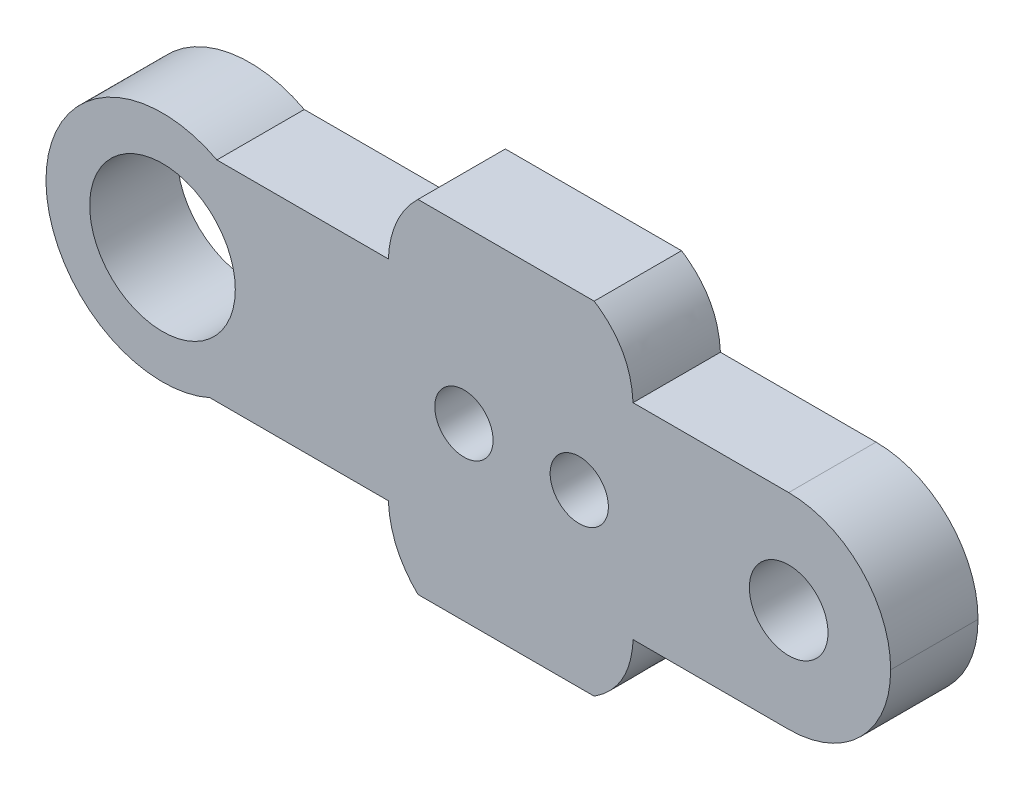
ISO-10303-21;
HEADER;
FILE_DESCRIPTION(('STEP AP214'),'2;1');
FILE_NAME('part.step','',(''),(''),'','','');
FILE_SCHEMA(('AUTOMOTIVE_DESIGN { 1 0 10303 214 1 1 1 1 }'));
ENDSEC;
DATA;
#1=APPLICATION_CONTEXT('core data for automotive mechanical design processes');
#2=APPLICATION_PROTOCOL_DEFINITION('international standard','automotive_design',2000,#1);
#3=PRODUCT_CONTEXT('',#1,'mechanical');
#4=PRODUCT('Part','Part','',(#3));
#5=PRODUCT_RELATED_PRODUCT_CATEGORY('part','',(#4));
#6=PRODUCT_DEFINITION_FORMATION('','',#4);
#7=PRODUCT_DEFINITION_CONTEXT('part definition',#1,'design');
#8=PRODUCT_DEFINITION('design','',#6,#7);
#9=PRODUCT_DEFINITION_SHAPE('','',#8);
#10=(LENGTH_UNIT() NAMED_UNIT(*) SI_UNIT(.MILLI.,.METRE.));
#11=(NAMED_UNIT(*) PLANE_ANGLE_UNIT() SI_UNIT($,.RADIAN.));
#12=(NAMED_UNIT(*) SI_UNIT($,.STERADIAN.) SOLID_ANGLE_UNIT());
#13=UNCERTAINTY_MEASURE_WITH_UNIT(LENGTH_MEASURE(1.E-05),#10,'distance_accuracy_value','');
#14=(GEOMETRIC_REPRESENTATION_CONTEXT(3) GLOBAL_UNCERTAINTY_ASSIGNED_CONTEXT((#13)) GLOBAL_UNIT_ASSIGNED_CONTEXT((#10,
#11,#12)) REPRESENTATION_CONTEXT('',''));
#15=CARTESIAN_POINT('',(0.,0.,0.));
#16=DIRECTION('',(0.,0.,1.));
#17=DIRECTION('',(1.,0.,0.));
#18=AXIS2_PLACEMENT_3D('',#15,#16,#17);
#19=CARTESIAN_POINT('',(21.4999681225819,-0.0214101903655824,3.));
#20=DIRECTION('',(0.,0.,-1.));
#21=DIRECTION('',(-1.,0.,0.));
#22=AXIS2_PLACEMENT_3D('',#19,#20,#21);
#23=PLANE('',#22);
#24=CARTESIAN_POINT('',(21.4999681225819,-0.0214101903655824,3.));
#25=DIRECTION('',(0.,0.,1.));
#26=DIRECTION('',(-1.,0.,0.));
#27=AXIS2_PLACEMENT_3D('',#24,#25,#26);
#28=CIRCLE('',#27,3.50000000000029);
#29=CARTESIAN_POINT('',(21.4999681225822,-3.52141019036587,3.));
#30=VERTEX_POINT('',#29);
#31=CARTESIAN_POINT('',(24.9999026367908,-1.06424607624819E-12,3.));
#32=VERTEX_POINT('',#31);
#33=EDGE_CURVE('E249',#30,#32,#28,.T.);
#34=ORIENTED_EDGE('',*,*,#33,.T.);
#35=CARTESIAN_POINT('',(21.4999681225822,0.0214101903658728,3.));
#36=DIRECTION('',(0.,0.,1.));
#37=DIRECTION('',(1.,0.,0.));
#38=AXIS2_PLACEMENT_3D('',#35,#36,#37);
#39=CIRCLE('',#38,3.5);
#40=CARTESIAN_POINT('',(21.4999681225822,3.52141019036587,3.));
#41=VERTEX_POINT('',#40);
#42=EDGE_CURVE('E115',#32,#41,#39,.T.);
#43=ORIENTED_EDGE('',*,*,#42,.T.);
#44=DIRECTION('',(-1.,0.,0.));
#45=VECTOR('',#44,1.);
#46=CARTESIAN_POINT('',(21.4999681225822,3.52141019036587,3.));
#47=LINE('',#46,#45);
#48=CARTESIAN_POINT('',(16.1562785524943,3.52141019036587,3.));
#49=VERTEX_POINT('',#48);
#50=EDGE_CURVE('E241',#41,#49,#47,.T.);
#51=ORIENTED_EDGE('',*,*,#50,.T.);
#52=CARTESIAN_POINT('',(16.1562785524943,3.52141019036587,3.));
#53=CARTESIAN_POINT('',(16.0881603388808,5.05153717266608,3.));
#54=CARTESIAN_POINT('',(14.8219003344393,5.87390950454192,3.));
#55=B_SPLINE_CURVE_WITH_KNOTS('',2,(#52,#53,#54),.UNSPECIFIED.,.F.,.F.,(3,3),(0.,1.),.UNSPECIFIED.);
#56=CARTESIAN_POINT('',(14.8219003344393,5.87390950454192,3.));
#57=VERTEX_POINT('',#56);
#58=EDGE_CURVE('E235',#49,#57,#55,.T.);
#59=ORIENTED_EDGE('',*,*,#58,.T.);
#60=DIRECTION('',(-1.,0.,0.));
#61=VECTOR('',#60,1.);
#62=CARTESIAN_POINT('',(8.77128221695817,5.87390950454192,3.));
#63=LINE('',#62,#61);
#64=CARTESIAN_POINT('',(8.77128221695817,5.87390950454192,3.));
#65=VERTEX_POINT('',#64);
#66=EDGE_CURVE('E214',#57,#65,#63,.T.);
#67=ORIENTED_EDGE('',*,*,#66,.T.);
#68=CARTESIAN_POINT('',(8.77128221695817,5.87390950454192,3.));
#69=CARTESIAN_POINT('',(7.81640396631,4.94468910288925,3.));
#70=CARTESIAN_POINT('',(7.75477837322135,3.59527965532397,3.));
#71=B_SPLINE_CURVE_WITH_KNOTS('',2,(#68,#69,#70),.UNSPECIFIED.,.F.,.F.,(3,3),(0.,1.),.UNSPECIFIED.);
#72=CARTESIAN_POINT('',(7.75477837322135,3.59527965532397,3.));
#73=VERTEX_POINT('',#72);
#74=EDGE_CURVE('E208',#65,#73,#71,.T.);
#75=ORIENTED_EDGE('',*,*,#74,.T.);
#76=DIRECTION('',(-1.,0.,0.));
#77=VECTOR('',#76,1.);
#78=CARTESIAN_POINT('',(1.86834673217975,3.59527965532397,3.));
#79=LINE('',#78,#77);
#80=CARTESIAN_POINT('',(1.86834673217975,3.59527965532397,3.));
#81=VERTEX_POINT('',#80);
#82=EDGE_CURVE('E205',#73,#81,#79,.T.);
#83=ORIENTED_EDGE('',*,*,#82,.T.);
#84=CARTESIAN_POINT('',(0.,0.0584335336566329,3.));
#85=DIRECTION('',(0.,0.,1.));
#86=DIRECTION('',(1.,0.,0.));
#87=AXIS2_PLACEMENT_3D('',#84,#85,#86);
#88=CIRCLE('',#87,4.);
#89=CARTESIAN_POINT('',(1.62799875081931,-3.59527965532397,3.));
#90=VERTEX_POINT('',#89);
#91=EDGE_CURVE('E202',#81,#90,#88,.T.);
#92=ORIENTED_EDGE('',*,*,#91,.T.);
#93=DIRECTION('',(1.,0.,0.));
#94=VECTOR('',#93,1.);
#95=CARTESIAN_POINT('',(1.62799875081931,-3.59527965532397,3.));
#96=LINE('',#95,#94);
#97=CARTESIAN_POINT('',(7.75477837322134,-3.59527965532397,3.));
#98=VERTEX_POINT('',#97);
#99=EDGE_CURVE('E196',#90,#98,#96,.T.);
#100=ORIENTED_EDGE('',*,*,#99,.T.);
#101=CARTESIAN_POINT('',(7.75477837322134,-3.59527965532397,3.));
#102=CARTESIAN_POINT('',(7.81640396631,-4.94468910288925,3.));
#103=CARTESIAN_POINT('',(8.77128221695817,-5.87390950454192,3.));
#104=B_SPLINE_CURVE_WITH_KNOTS('',2,(#101,#102,#103),.UNSPECIFIED.,.F.,.F.,(3,3),(0.,1.),.UNSPECIFIED.);
#105=CARTESIAN_POINT('',(8.77128221695817,-5.87390950454192,3.));
#106=VERTEX_POINT('',#105);
#107=EDGE_CURVE('E149',#98,#106,#104,.T.);
#108=ORIENTED_EDGE('',*,*,#107,.T.);
#109=DIRECTION('',(1.,0.,0.));
#110=VECTOR('',#109,1.);
#111=CARTESIAN_POINT('',(8.77128221695817,-5.87390950454192,3.));
#112=LINE('',#111,#110);
#113=CARTESIAN_POINT('',(14.8219003344393,-5.87390950454192,3.));
#114=VERTEX_POINT('',#113);
#115=EDGE_CURVE('E143',#106,#114,#112,.T.);
#116=ORIENTED_EDGE('',*,*,#115,.T.);
#117=CARTESIAN_POINT('',(14.8219003344393,-5.87390950454192,3.));
#118=CARTESIAN_POINT('',(16.0881603388808,-5.05153717266608,3.));
#119=CARTESIAN_POINT('',(16.1562785524943,-3.52141019036587,3.));
#120=B_SPLINE_CURVE_WITH_KNOTS('',2,(#117,#118,#119),.UNSPECIFIED.,.F.,.F.,(3,3),(0.,1.),.UNSPECIFIED.);
#121=CARTESIAN_POINT('',(16.1562785524943,-3.52141019036587,3.));
#122=VERTEX_POINT('',#121);
#123=EDGE_CURVE('E147',#114,#122,#120,.T.);
#124=ORIENTED_EDGE('',*,*,#123,.T.);
#125=DIRECTION('',(1.,0.,0.));
#126=VECTOR('',#125,1.);
#127=CARTESIAN_POINT('',(21.4999681225822,-3.52141019036587,3.));
#128=LINE('',#127,#126);
#129=EDGE_CURVE('E57',#122,#30,#128,.T.);
#130=ORIENTED_EDGE('',*,*,#129,.T.);
#131=EDGE_LOOP('',(#34,#43,#51,#59,#67,#75,#83,#92,#100,#108,#116,#124,#130));
#132=FACE_BOUND('',#131,.T.);
#133=CARTESIAN_POINT('',(0.,0.0584335336566329,3.));
#134=DIRECTION('',(0.,0.,1.));
#135=DIRECTION('',(1.,0.,0.));
#136=AXIS2_PLACEMENT_3D('',#133,#134,#135);
#137=CIRCLE('',#136,2.5);
#138=CARTESIAN_POINT('',(2.5,0.0584335336566329,3.));
#139=VERTEX_POINT('',#138);
#140=EDGE_CURVE('E256',#139,#139,#137,.T.);
#141=ORIENTED_EDGE('',*,*,#140,.F.);
#142=EDGE_LOOP('',(#141));
#143=FACE_BOUND('',#142,.T.);
#144=CARTESIAN_POINT('',(10.35,0.,3.));
#145=DIRECTION('',(0.,0.,1.));
#146=DIRECTION('',(1.,0.,0.));
#147=AXIS2_PLACEMENT_3D('',#144,#145,#146);
#148=CIRCLE('',#147,1.);
#149=CARTESIAN_POINT('',(11.35,0.,3.));
#150=VERTEX_POINT('',#149);
#151=EDGE_CURVE('E257',#150,#150,#148,.T.);
#152=ORIENTED_EDGE('',*,*,#151,.F.);
#153=EDGE_LOOP('',(#152));
#154=FACE_BOUND('',#153,.T.);
#155=CARTESIAN_POINT('',(14.31,0.,3.));
#156=DIRECTION('',(0.,0.,1.));
#157=DIRECTION('',(1.,0.,0.));
#158=AXIS2_PLACEMENT_3D('',#155,#156,#157);
#159=CIRCLE('',#158,1.);
#160=CARTESIAN_POINT('',(15.31,0.,3.));
#161=VERTEX_POINT('',#160);
#162=EDGE_CURVE('E266',#161,#161,#159,.T.);
#163=ORIENTED_EDGE('',*,*,#162,.F.);
#164=EDGE_LOOP('',(#163));
#165=FACE_BOUND('',#164,.T.);
#166=CARTESIAN_POINT('',(21.4999681225822,0.0214101903658728,3.));
#167=DIRECTION('',(0.,0.,1.));
#168=DIRECTION('',(1.,0.,0.));
#169=AXIS2_PLACEMENT_3D('',#166,#167,#168);
#170=CIRCLE('',#169,1.35);
#171=CARTESIAN_POINT('',(22.8499681225822,0.0214101903658728,3.));
#172=VERTEX_POINT('',#171);
#173=EDGE_CURVE('E274',#172,#172,#170,.T.);
#174=ORIENTED_EDGE('',*,*,#173,.F.);
#175=EDGE_LOOP('',(#174));
#176=FACE_BOUND('',#175,.T.);
#177=ADVANCED_FACE('F39',(#132,#143,#154,#165,#176),#23,.F.);
#178=CARTESIAN_POINT('',(21.4999681225819,-0.0214101903655824,0.));
#179=DIRECTION('',(0.,0.,-1.));
#180=DIRECTION('',(-1.,0.,0.));
#181=AXIS2_PLACEMENT_3D('',#178,#179,#180);
#182=PLANE('',#181);
#183=CARTESIAN_POINT('',(14.31,0.,0.));
#184=DIRECTION('',(0.,0.,1.));
#185=DIRECTION('',(1.,0.,0.));
#186=AXIS2_PLACEMENT_3D('',#183,#184,#185);
#187=CIRCLE('',#186,1.);
#188=CARTESIAN_POINT('',(15.31,0.,0.));
#189=VERTEX_POINT('',#188);
#190=EDGE_CURVE('E270',#189,#189,#187,.T.);
#191=ORIENTED_EDGE('',*,*,#190,.T.);
#192=EDGE_LOOP('',(#191));
#193=FACE_BOUND('',#192,.T.);
#194=CARTESIAN_POINT('',(0.,0.0584335336566329,0.));
#195=DIRECTION('',(0.,0.,1.));
#196=DIRECTION('',(1.,0.,0.));
#197=AXIS2_PLACEMENT_3D('',#194,#195,#196);
#198=CIRCLE('',#197,2.5);
#199=CARTESIAN_POINT('',(2.5,0.0584335336566329,0.));
#200=VERTEX_POINT('',#199);
#201=EDGE_CURVE('E252',#200,#200,#198,.T.);
#202=ORIENTED_EDGE('',*,*,#201,.T.);
#203=EDGE_LOOP('',(#202));
#204=FACE_BOUND('',#203,.T.);
#205=CARTESIAN_POINT('',(21.4999681225819,-0.0214101903655824,0.));
#206=DIRECTION('',(0.,0.,1.));
#207=DIRECTION('',(-1.,0.,0.));
#208=AXIS2_PLACEMENT_3D('',#205,#206,#207);
#209=CIRCLE('',#208,3.50000000000029);
#210=CARTESIAN_POINT('',(21.4999681225822,-3.52141019036587,0.));
#211=VERTEX_POINT('',#210);
#212=CARTESIAN_POINT('',(24.9999026367908,-1.06424607624819E-12,0.));
#213=VERTEX_POINT('',#212);
#214=EDGE_CURVE('E261',#211,#213,#209,.T.);
#215=ORIENTED_EDGE('',*,*,#214,.F.);
#216=DIRECTION('',(1.,0.,0.));
#217=VECTOR('',#216,1.);
#218=CARTESIAN_POINT('',(21.4999681225822,-3.52141019036587,0.));
#219=LINE('',#218,#217);
#220=CARTESIAN_POINT('',(16.1562785524943,-3.52141019036587,0.));
#221=VERTEX_POINT('',#220);
#222=EDGE_CURVE('E107',#221,#211,#219,.T.);
#223=ORIENTED_EDGE('',*,*,#222,.F.);
#224=CARTESIAN_POINT('',(14.8219003344393,-5.87390950454192,0.));
#225=CARTESIAN_POINT('',(16.0881603388808,-5.05153717266608,0.));
#226=CARTESIAN_POINT('',(16.1562785524943,-3.52141019036587,0.));
#227=B_SPLINE_CURVE_WITH_KNOTS('',2,(#224,#225,#226),.UNSPECIFIED.,.F.,.F.,(3,3),(0.,1.),.UNSPECIFIED.);
#228=CARTESIAN_POINT('',(14.8219003344393,-5.87390950454192,0.));
#229=VERTEX_POINT('',#228);
#230=EDGE_CURVE('E101',#229,#221,#227,.T.);
#231=ORIENTED_EDGE('',*,*,#230,.F.);
#232=DIRECTION('',(1.,0.,0.));
#233=VECTOR('',#232,1.);
#234=CARTESIAN_POINT('',(8.77128221695817,-5.87390950454192,0.));
#235=LINE('',#234,#233);
#236=CARTESIAN_POINT('',(8.77128221695817,-5.87390950454192,0.));
#237=VERTEX_POINT('',#236);
#238=EDGE_CURVE('E158',#237,#229,#235,.T.);
#239=ORIENTED_EDGE('',*,*,#238,.F.);
#240=CARTESIAN_POINT('',(7.75477837322134,-3.59527965532397,0.));
#241=CARTESIAN_POINT('',(7.81640396631,-4.94468910288925,0.));
#242=CARTESIAN_POINT('',(8.77128221695817,-5.87390950454192,0.));
#243=B_SPLINE_CURVE_WITH_KNOTS('',2,(#240,#241,#242),.UNSPECIFIED.,.F.,.F.,(3,3),(0.,1.),.UNSPECIFIED.);
#244=CARTESIAN_POINT('',(7.75477837322134,-3.59527965532397,0.));
#245=VERTEX_POINT('',#244);
#246=EDGE_CURVE('E477',#245,#237,#243,.T.);
#247=ORIENTED_EDGE('',*,*,#246,.F.);
#248=DIRECTION('',(1.,0.,0.));
#249=VECTOR('',#248,1.);
#250=CARTESIAN_POINT('',(1.62799875081931,-3.59527965532397,0.));
#251=LINE('',#250,#249);
#252=CARTESIAN_POINT('',(1.62799875081931,-3.59527965532397,0.));
#253=VERTEX_POINT('',#252);
#254=EDGE_CURVE('E474',#253,#245,#251,.T.);
#255=ORIENTED_EDGE('',*,*,#254,.F.);
#256=CARTESIAN_POINT('',(0.,0.0584335336566329,0.));
#257=DIRECTION('',(0.,0.,1.));
#258=DIRECTION('',(1.,0.,0.));
#259=AXIS2_PLACEMENT_3D('',#256,#257,#258);
#260=CIRCLE('',#259,4.);
#261=CARTESIAN_POINT('',(1.86834673217975,3.59527965532397,0.));
#262=VERTEX_POINT('',#261);
#263=EDGE_CURVE('E471',#262,#253,#260,.T.);
#264=ORIENTED_EDGE('',*,*,#263,.F.);
#265=DIRECTION('',(-1.,0.,0.));
#266=VECTOR('',#265,1.);
#267=CARTESIAN_POINT('',(1.86834673217975,3.59527965532397,0.));
#268=LINE('',#267,#266);
#269=CARTESIAN_POINT('',(7.75477837322135,3.59527965532397,0.));
#270=VERTEX_POINT('',#269);
#271=EDGE_CURVE('E465',#270,#262,#268,.T.);
#272=ORIENTED_EDGE('',*,*,#271,.F.);
#273=CARTESIAN_POINT('',(8.77128221695817,5.87390950454192,0.));
#274=CARTESIAN_POINT('',(7.81640396631,4.94468910288925,0.));
#275=CARTESIAN_POINT('',(7.75477837322135,3.59527965532397,0.));
#276=B_SPLINE_CURVE_WITH_KNOTS('',2,(#273,#274,#275),.UNSPECIFIED.,.F.,.F.,(3,3),(0.,1.),.UNSPECIFIED.);
#277=CARTESIAN_POINT('',(8.77128221695817,5.87390950454192,0.));
#278=VERTEX_POINT('',#277);
#279=EDGE_CURVE('E460',#278,#270,#276,.T.);
#280=ORIENTED_EDGE('',*,*,#279,.F.);
#281=DIRECTION('',(-1.,0.,0.));
#282=VECTOR('',#281,1.);
#283=CARTESIAN_POINT('',(8.77128221695817,5.87390950454192,0.));
#284=LINE('',#283,#282);
#285=CARTESIAN_POINT('',(14.8219003344393,5.87390950454192,0.));
#286=VERTEX_POINT('',#285);
#287=EDGE_CURVE('E454',#286,#278,#284,.T.);
#288=ORIENTED_EDGE('',*,*,#287,.F.);
#289=CARTESIAN_POINT('',(16.1562785524943,3.52141019036587,0.));
#290=CARTESIAN_POINT('',(16.0881603388808,5.05153717266608,0.));
#291=CARTESIAN_POINT('',(14.8219003344393,5.87390950454192,0.));
#292=B_SPLINE_CURVE_WITH_KNOTS('',2,(#289,#290,#291),.UNSPECIFIED.,.F.,.F.,(3,3),(0.,1.),.UNSPECIFIED.);
#293=CARTESIAN_POINT('',(16.1562785524943,3.52141019036587,0.));
#294=VERTEX_POINT('',#293);
#295=EDGE_CURVE('E449',#294,#286,#292,.T.);
#296=ORIENTED_EDGE('',*,*,#295,.F.);
#297=DIRECTION('',(-1.,0.,0.));
#298=VECTOR('',#297,1.);
#299=CARTESIAN_POINT('',(21.4999681225822,3.52141019036587,0.));
#300=LINE('',#299,#298);
#301=CARTESIAN_POINT('',(21.4999681225822,3.52141019036587,0.));
#302=VERTEX_POINT('',#301);
#303=EDGE_CURVE('E444',#302,#294,#300,.T.);
#304=ORIENTED_EDGE('',*,*,#303,.F.);
#305=CARTESIAN_POINT('',(21.4999681225822,0.0214101903658728,0.));
#306=DIRECTION('',(0.,0.,1.));
#307=DIRECTION('',(1.,0.,0.));
#308=AXIS2_PLACEMENT_3D('',#305,#306,#307);
#309=CIRCLE('',#308,3.5);
#310=EDGE_CURVE('E442',#213,#302,#309,.T.);
#311=ORIENTED_EDGE('',*,*,#310,.F.);
#312=EDGE_LOOP('',(#215,#223,#231,#239,#247,#255,#264,#272,#280,#288,#296,#304,#311));
#313=FACE_BOUND('',#312,.T.);
#314=CARTESIAN_POINT('',(10.35,0.,0.));
#315=DIRECTION('',(0.,0.,1.));
#316=DIRECTION('',(1.,0.,0.));
#317=AXIS2_PLACEMENT_3D('',#314,#315,#316);
#318=CIRCLE('',#317,1.);
#319=CARTESIAN_POINT('',(11.35,0.,0.));
#320=VERTEX_POINT('',#319);
#321=EDGE_CURVE('E262',#320,#320,#318,.T.);
#322=ORIENTED_EDGE('',*,*,#321,.T.);
#323=EDGE_LOOP('',(#322));
#324=FACE_BOUND('',#323,.T.);
#325=CARTESIAN_POINT('',(21.4999681225822,0.0214101903658728,0.));
#326=DIRECTION('',(0.,0.,1.));
#327=DIRECTION('',(1.,0.,0.));
#328=AXIS2_PLACEMENT_3D('',#325,#326,#327);
#329=CIRCLE('',#328,1.35);
#330=CARTESIAN_POINT('',(22.8499681225822,0.0214101903658728,0.));
#331=VERTEX_POINT('',#330);
#332=EDGE_CURVE('E278',#331,#331,#329,.T.);
#333=ORIENTED_EDGE('',*,*,#332,.T.);
#334=EDGE_LOOP('',(#333));
#335=FACE_BOUND('',#334,.T.);
#336=ADVANCED_FACE('F290',(#193,#204,#313,#324,#335),#182,.T.);
#337=CARTESIAN_POINT('',(21.4999681225819,-0.0214101903655824,3.));
#338=DIRECTION('',(0.,0.,-1.));
#339=DIRECTION('',(-1.,0.,0.));
#340=AXIS2_PLACEMENT_3D('',#337,#338,#339);
#341=CYLINDRICAL_SURFACE('',#340,3.50000000000029);
#342=ORIENTED_EDGE('',*,*,#214,.T.);
#343=DIRECTION('',(0.,0.,-1.));
#344=VECTOR('',#343,1.);
#345=CARTESIAN_POINT('',(24.9999026367908,-1.06424607624819E-12,3.));
#346=LINE('',#345,#344);
#347=EDGE_CURVE('E11',#32,#213,#346,.T.);
#348=ORIENTED_EDGE('',*,*,#347,.F.);
#349=ORIENTED_EDGE('',*,*,#33,.F.);
#350=DIRECTION('',(0.,0.,-1.));
#351=VECTOR('',#350,1.);
#352=CARTESIAN_POINT('',(21.4999681225822,-3.52141019036587,3.));
#353=LINE('',#352,#351);
#354=EDGE_CURVE('E167',#30,#211,#353,.T.);
#355=ORIENTED_EDGE('',*,*,#354,.T.);
#356=EDGE_LOOP('',(#342,#348,#349,#355));
#357=FACE_BOUND('',#356,.T.);
#358=ADVANCED_FACE('F41',(#357),#341,.T.);
#359=CARTESIAN_POINT('',(21.4999681225822,0.0214101903658728,3.));
#360=DIRECTION('',(0.,0.,-1.));
#361=DIRECTION('',(-1.,0.,0.));
#362=AXIS2_PLACEMENT_3D('',#359,#360,#361);
#363=CYLINDRICAL_SURFACE('',#362,3.5);
#364=ORIENTED_EDGE('',*,*,#310,.T.);
#365=DIRECTION('',(0.,0.,-1.));
#366=VECTOR('',#365,1.);
#367=CARTESIAN_POINT('',(21.4999681225822,3.52141019036587,3.));
#368=LINE('',#367,#366);
#369=EDGE_CURVE('E49',#41,#302,#368,.T.);
#370=ORIENTED_EDGE('',*,*,#369,.F.);
#371=ORIENTED_EDGE('',*,*,#42,.F.);
#372=ORIENTED_EDGE('',*,*,#347,.T.);
#373=EDGE_LOOP('',(#364,#370,#371,#372));
#374=FACE_BOUND('',#373,.T.);
#375=ADVANCED_FACE('F378',(#374),#363,.T.);
#376=CARTESIAN_POINT('',(21.4999681225822,3.52141019036587,3.));
#377=DIRECTION('',(0.,-1.,0.));
#378=DIRECTION('',(0.,0.,-1.));
#379=AXIS2_PLACEMENT_3D('',#376,#377,#378);
#380=PLANE('',#379);
#381=ORIENTED_EDGE('',*,*,#303,.T.);
#382=DIRECTION('',(0.,0.,-1.));
#383=VECTOR('',#382,1.);
#384=CARTESIAN_POINT('',(16.1562785524943,3.52141019036587,3.));
#385=LINE('',#384,#383);
#386=EDGE_CURVE('E526',#49,#294,#385,.T.);
#387=ORIENTED_EDGE('',*,*,#386,.F.);
#388=ORIENTED_EDGE('',*,*,#50,.F.);
#389=ORIENTED_EDGE('',*,*,#369,.T.);
#390=EDGE_LOOP('',(#381,#387,#388,#389));
#391=FACE_BOUND('',#390,.T.);
#392=ADVANCED_FACE('F233',(#391),#380,.F.);
#393=DIRECTION('',(0.,0.,-1.));
#394=VECTOR('',#393,1.);
#395=SURFACE_OF_LINEAR_EXTRUSION('',#55,#394);
#396=ORIENTED_EDGE('',*,*,#295,.T.);
#397=DIRECTION('',(0.,0.,-1.));
#398=VECTOR('',#397,1.);
#399=CARTESIAN_POINT('',(14.8219003344393,5.87390950454192,3.));
#400=LINE('',#399,#398);
#401=EDGE_CURVE('E522',#57,#286,#400,.T.);
#402=ORIENTED_EDGE('',*,*,#401,.F.);
#403=ORIENTED_EDGE('',*,*,#58,.F.);
#404=ORIENTED_EDGE('',*,*,#386,.T.);
#405=EDGE_LOOP('',(#396,#402,#403,#404));
#406=FACE_BOUND('',#405,.T.);
#407=ADVANCED_FACE('F229',(#406),#395,.F.);
#408=CARTESIAN_POINT('',(8.77128221695817,5.87390950454192,3.));
#409=DIRECTION('',(0.,-1.,0.));
#410=DIRECTION('',(0.,0.,-1.));
#411=AXIS2_PLACEMENT_3D('',#408,#409,#410);
#412=PLANE('',#411);
#413=ORIENTED_EDGE('',*,*,#287,.T.);
#414=DIRECTION('',(0.,0.,-1.));
#415=VECTOR('',#414,1.);
#416=CARTESIAN_POINT('',(8.77128221695817,5.87390950454192,3.));
#417=LINE('',#416,#415);
#418=EDGE_CURVE('E518',#65,#278,#417,.T.);
#419=ORIENTED_EDGE('',*,*,#418,.F.);
#420=ORIENTED_EDGE('',*,*,#66,.F.);
#421=ORIENTED_EDGE('',*,*,#401,.T.);
#422=EDGE_LOOP('',(#413,#419,#420,#421));
#423=FACE_BOUND('',#422,.T.);
#424=ADVANCED_FACE('F225',(#423),#412,.F.);
#425=DIRECTION('',(0.,0.,-1.));
#426=VECTOR('',#425,1.);
#427=SURFACE_OF_LINEAR_EXTRUSION('',#71,#426);
#428=ORIENTED_EDGE('',*,*,#279,.T.);
#429=DIRECTION('',(0.,0.,-1.));
#430=VECTOR('',#429,1.);
#431=CARTESIAN_POINT('',(7.75477837322135,3.59527965532397,3.));
#432=LINE('',#431,#430);
#433=EDGE_CURVE('E514',#73,#270,#432,.T.);
#434=ORIENTED_EDGE('',*,*,#433,.F.);
#435=ORIENTED_EDGE('',*,*,#74,.F.);
#436=ORIENTED_EDGE('',*,*,#418,.T.);
#437=EDGE_LOOP('',(#428,#434,#435,#436));
#438=FACE_BOUND('',#437,.T.);
#439=ADVANCED_FACE('F220',(#438),#427,.F.);
#440=CARTESIAN_POINT('',(1.86834673217975,3.59527965532397,3.));
#441=DIRECTION('',(0.,-1.,0.));
#442=DIRECTION('',(0.,0.,-1.));
#443=AXIS2_PLACEMENT_3D('',#440,#441,#442);
#444=PLANE('',#443);
#445=ORIENTED_EDGE('',*,*,#271,.T.);
#446=DIRECTION('',(0.,0.,-1.));
#447=VECTOR('',#446,1.);
#448=CARTESIAN_POINT('',(1.86834673217975,3.59527965532397,3.));
#449=LINE('',#448,#447);
#450=EDGE_CURVE('E510',#81,#262,#449,.T.);
#451=ORIENTED_EDGE('',*,*,#450,.F.);
#452=ORIENTED_EDGE('',*,*,#82,.F.);
#453=ORIENTED_EDGE('',*,*,#433,.T.);
#454=EDGE_LOOP('',(#445,#451,#452,#453));
#455=FACE_BOUND('',#454,.T.);
#456=ADVANCED_FACE('F224',(#455),#444,.F.);
#457=CARTESIAN_POINT('',(0.,0.0584335336566329,3.));
#458=DIRECTION('',(0.,0.,-1.));
#459=DIRECTION('',(-1.,0.,0.));
#460=AXIS2_PLACEMENT_3D('',#457,#458,#459);
#461=CYLINDRICAL_SURFACE('',#460,4.);
#462=ORIENTED_EDGE('',*,*,#263,.T.);
#463=DIRECTION('',(0.,0.,-1.));
#464=VECTOR('',#463,1.);
#465=CARTESIAN_POINT('',(1.62799875081931,-3.59527965532397,3.));
#466=LINE('',#465,#464);
#467=EDGE_CURVE('E506',#90,#253,#466,.T.);
#468=ORIENTED_EDGE('',*,*,#467,.F.);
#469=ORIENTED_EDGE('',*,*,#91,.F.);
#470=ORIENTED_EDGE('',*,*,#450,.T.);
#471=EDGE_LOOP('',(#462,#468,#469,#470));
#472=FACE_BOUND('',#471,.T.);
#473=ADVANCED_FACE('F347',(#472),#461,.T.);
#474=CARTESIAN_POINT('',(1.62799875081931,-3.59527965532397,3.));
#475=DIRECTION('',(0.,1.,0.));
#476=DIRECTION('',(0.,0.,1.));
#477=AXIS2_PLACEMENT_3D('',#474,#475,#476);
#478=PLANE('',#477);
#479=ORIENTED_EDGE('',*,*,#254,.T.);
#480=DIRECTION('',(0.,0.,-1.));
#481=VECTOR('',#480,1.);
#482=CARTESIAN_POINT('',(7.75477837322134,-3.59527965532397,3.));
#483=LINE('',#482,#481);
#484=EDGE_CURVE('E502',#98,#245,#483,.T.);
#485=ORIENTED_EDGE('',*,*,#484,.F.);
#486=ORIENTED_EDGE('',*,*,#99,.F.);
#487=ORIENTED_EDGE('',*,*,#467,.T.);
#488=EDGE_LOOP('',(#479,#485,#486,#487));
#489=FACE_BOUND('',#488,.T.);
#490=ADVANCED_FACE('F188',(#489),#478,.F.);
#491=DIRECTION('',(0.,0.,-1.));
#492=VECTOR('',#491,1.);
#493=SURFACE_OF_LINEAR_EXTRUSION('',#104,#492);
#494=ORIENTED_EDGE('',*,*,#246,.T.);
#495=DIRECTION('',(0.,0.,-1.));
#496=VECTOR('',#495,1.);
#497=CARTESIAN_POINT('',(8.77128221695817,-5.87390950454192,3.));
#498=LINE('',#497,#496);
#499=EDGE_CURVE('E160',#106,#237,#498,.T.);
#500=ORIENTED_EDGE('',*,*,#499,.F.);
#501=ORIENTED_EDGE('',*,*,#107,.F.);
#502=ORIENTED_EDGE('',*,*,#484,.T.);
#503=EDGE_LOOP('',(#494,#500,#501,#502));
#504=FACE_BOUND('',#503,.T.);
#505=ADVANCED_FACE('F185',(#504),#493,.F.);
#506=CARTESIAN_POINT('',(8.77128221695817,-5.87390950454192,3.));
#507=DIRECTION('',(0.,1.,0.));
#508=DIRECTION('',(0.,0.,1.));
#509=AXIS2_PLACEMENT_3D('',#506,#507,#508);
#510=PLANE('',#509);
#511=ORIENTED_EDGE('',*,*,#238,.T.);
#512=DIRECTION('',(0.,0.,-1.));
#513=VECTOR('',#512,1.);
#514=CARTESIAN_POINT('',(14.8219003344393,-5.87390950454192,3.));
#515=LINE('',#514,#513);
#516=EDGE_CURVE('E155',#114,#229,#515,.T.);
#517=ORIENTED_EDGE('',*,*,#516,.F.);
#518=ORIENTED_EDGE('',*,*,#115,.F.);
#519=ORIENTED_EDGE('',*,*,#499,.T.);
#520=EDGE_LOOP('',(#511,#517,#518,#519));
#521=FACE_BOUND('',#520,.T.);
#522=ADVANCED_FACE('F156',(#521),#510,.F.);
#523=DIRECTION('',(0.,0.,-1.));
#524=VECTOR('',#523,1.);
#525=SURFACE_OF_LINEAR_EXTRUSION('',#120,#524);
#526=ORIENTED_EDGE('',*,*,#230,.T.);
#527=DIRECTION('',(0.,0.,-1.));
#528=VECTOR('',#527,1.);
#529=CARTESIAN_POINT('',(16.1562785524943,-3.52141019036587,3.));
#530=LINE('',#529,#528);
#531=EDGE_CURVE('E161',#122,#221,#530,.T.);
#532=ORIENTED_EDGE('',*,*,#531,.F.);
#533=ORIENTED_EDGE('',*,*,#123,.F.);
#534=ORIENTED_EDGE('',*,*,#516,.T.);
#535=EDGE_LOOP('',(#526,#532,#533,#534));
#536=FACE_BOUND('',#535,.T.);
#537=ADVANCED_FACE('F163',(#536),#525,.F.);
#538=CARTESIAN_POINT('',(21.4999681225822,-3.52141019036587,3.));
#539=DIRECTION('',(0.,1.,0.));
#540=DIRECTION('',(0.,0.,1.));
#541=AXIS2_PLACEMENT_3D('',#538,#539,#540);
#542=PLANE('',#541);
#543=ORIENTED_EDGE('',*,*,#222,.T.);
#544=ORIENTED_EDGE('',*,*,#354,.F.);
#545=ORIENTED_EDGE('',*,*,#129,.F.);
#546=ORIENTED_EDGE('',*,*,#531,.T.);
#547=EDGE_LOOP('',(#543,#544,#545,#546));
#548=FACE_BOUND('',#547,.T.);
#549=ADVANCED_FACE('F181',(#548),#542,.F.);
#550=CARTESIAN_POINT('',(0.,0.0584335336566329,3.));
#551=DIRECTION('',(0.,0.,-1.));
#552=DIRECTION('',(-1.,0.,0.));
#553=AXIS2_PLACEMENT_3D('',#550,#551,#552);
#554=CYLINDRICAL_SURFACE('',#553,2.5);
#555=ORIENTED_EDGE('',*,*,#140,.T.);
#556=EDGE_LOOP('',(#555));
#557=FACE_BOUND('',#556,.T.);
#558=ORIENTED_EDGE('',*,*,#201,.F.);
#559=EDGE_LOOP('',(#558));
#560=FACE_BOUND('',#559,.T.);
#561=ADVANCED_FACE('F297',(#557,#560),#554,.F.);
#562=CARTESIAN_POINT('',(10.35,0.,3.));
#563=DIRECTION('',(0.,0.,-1.));
#564=DIRECTION('',(-1.,0.,0.));
#565=AXIS2_PLACEMENT_3D('',#562,#563,#564);
#566=CYLINDRICAL_SURFACE('',#565,1.);
#567=ORIENTED_EDGE('',*,*,#151,.T.);
#568=EDGE_LOOP('',(#567));
#569=FACE_BOUND('',#568,.T.);
#570=ORIENTED_EDGE('',*,*,#321,.F.);
#571=EDGE_LOOP('',(#570));
#572=FACE_BOUND('',#571,.T.);
#573=ADVANCED_FACE('F300',(#569,#572),#566,.F.);
#574=CARTESIAN_POINT('',(14.31,0.,3.));
#575=DIRECTION('',(0.,0.,-1.));
#576=DIRECTION('',(-1.,0.,0.));
#577=AXIS2_PLACEMENT_3D('',#574,#575,#576);
#578=CYLINDRICAL_SURFACE('',#577,1.);
#579=ORIENTED_EDGE('',*,*,#162,.T.);
#580=EDGE_LOOP('',(#579));
#581=FACE_BOUND('',#580,.T.);
#582=ORIENTED_EDGE('',*,*,#190,.F.);
#583=EDGE_LOOP('',(#582));
#584=FACE_BOUND('',#583,.T.);
#585=ADVANCED_FACE('F304',(#581,#584),#578,.F.);
#586=CARTESIAN_POINT('',(21.4999681225822,0.0214101903658728,3.));
#587=DIRECTION('',(0.,0.,-1.));
#588=DIRECTION('',(-1.,0.,0.));
#589=AXIS2_PLACEMENT_3D('',#586,#587,#588);
#590=CYLINDRICAL_SURFACE('',#589,1.35);
#591=ORIENTED_EDGE('',*,*,#173,.T.);
#592=EDGE_LOOP('',(#591));
#593=FACE_BOUND('',#592,.T.);
#594=ORIENTED_EDGE('',*,*,#332,.F.);
#595=EDGE_LOOP('',(#594));
#596=FACE_BOUND('',#595,.T.);
#597=ADVANCED_FACE('F286',(#593,#596),#590,.F.);
#598=CLOSED_SHELL('',(#177,#336,#358,#375,#392,#407,#424,#439,#456,#473,#490,#505,#522,#537,
#549,#561,#573,#585,#597));
#599=MANIFOLD_SOLID_BREP('B2',#598);
#600=ADVANCED_BREP_SHAPE_REPRESENTATION('',(#18,#599),#14);
#601=SHAPE_DEFINITION_REPRESENTATION(#9,#600);
ENDSEC;
END-ISO-10303-21;
